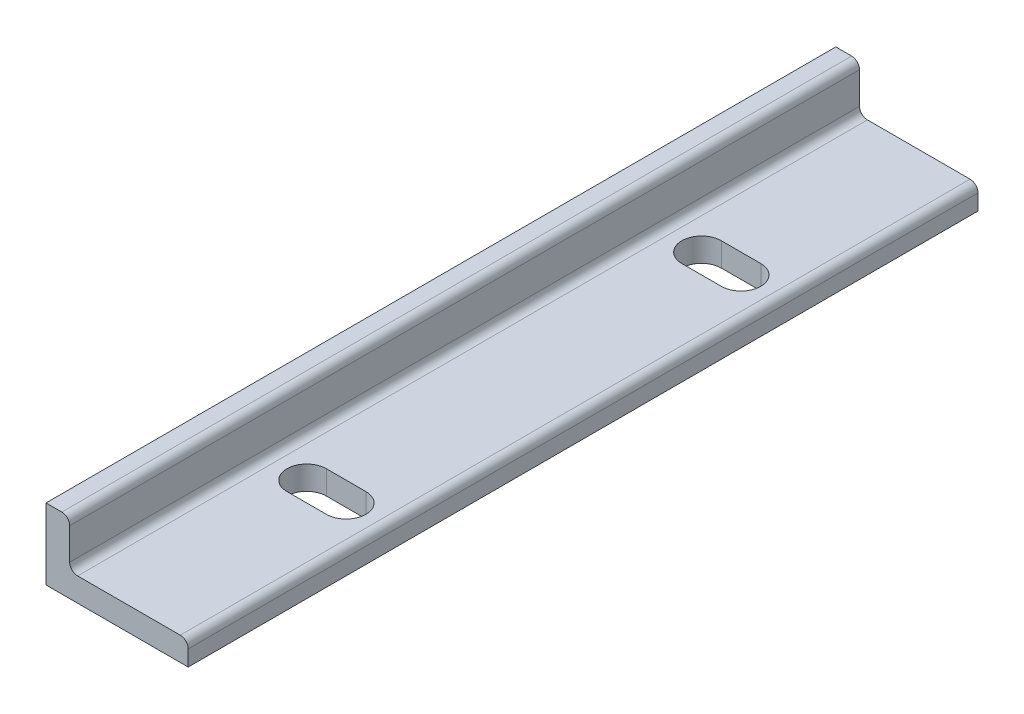
ISO-10303-21;
HEADER;
FILE_DESCRIPTION(('STEP AP214'),'2;1');
FILE_NAME('part.step','',(''),(''),'','','');
FILE_SCHEMA(('AUTOMOTIVE_DESIGN { 1 0 10303 214 1 1 1 1 }'));
ENDSEC;
DATA;
#1=APPLICATION_CONTEXT('core data for automotive mechanical design processes');
#2=APPLICATION_PROTOCOL_DEFINITION('international standard','automotive_design',2000,#1);
#3=PRODUCT_CONTEXT('',#1,'mechanical');
#4=PRODUCT('Part','Part','',(#3));
#5=PRODUCT_RELATED_PRODUCT_CATEGORY('part','',(#4));
#6=PRODUCT_DEFINITION_FORMATION('','',#4);
#7=PRODUCT_DEFINITION_CONTEXT('part definition',#1,'design');
#8=PRODUCT_DEFINITION('design','',#6,#7);
#9=PRODUCT_DEFINITION_SHAPE('','',#8);
#10=(LENGTH_UNIT() NAMED_UNIT(*) SI_UNIT(.MILLI.,.METRE.));
#11=(NAMED_UNIT(*) PLANE_ANGLE_UNIT() SI_UNIT($,.RADIAN.));
#12=(NAMED_UNIT(*) SI_UNIT($,.STERADIAN.) SOLID_ANGLE_UNIT());
#13=UNCERTAINTY_MEASURE_WITH_UNIT(LENGTH_MEASURE(1.E-05),#10,'distance_accuracy_value','');
#14=(GEOMETRIC_REPRESENTATION_CONTEXT(3) GLOBAL_UNCERTAINTY_ASSIGNED_CONTEXT((#13)) GLOBAL_UNIT_ASSIGNED_CONTEXT((#10,
#11,#12)) REPRESENTATION_CONTEXT('',''));
#15=CARTESIAN_POINT('',(0.,0.,0.));
#16=DIRECTION('',(0.,0.,1.));
#17=DIRECTION('',(1.,0.,0.));
#18=AXIS2_PLACEMENT_3D('',#15,#16,#17);
#19=CARTESIAN_POINT('',(0.,9.,100.));
#20=DIRECTION('',(1.,0.,0.));
#21=DIRECTION('',(0.,1.,0.));
#22=AXIS2_PLACEMENT_3D('',#19,#20,#21);
#23=PLANE('',#22);
#24=DIRECTION('',(0.,-1.,0.));
#25=VECTOR('',#24,1.);
#26=CARTESIAN_POINT('',(0.,9.,0.));
#27=LINE('',#26,#25);
#28=CARTESIAN_POINT('',(0.,9.,0.));
#29=VERTEX_POINT('',#28);
#30=CARTESIAN_POINT('',(0.,0.,0.));
#31=VERTEX_POINT('',#30);
#32=EDGE_CURVE('E208',#29,#31,#27,.T.);
#33=ORIENTED_EDGE('',*,*,#32,.T.);
#34=DIRECTION('',(0.,0.,-1.));
#35=VECTOR('',#34,1.);
#36=CARTESIAN_POINT('',(0.,0.,100.));
#37=LINE('',#36,#35);
#38=CARTESIAN_POINT('',(0.,0.,100.));
#39=VERTEX_POINT('',#38);
#40=EDGE_CURVE('E306',#39,#31,#37,.T.);
#41=ORIENTED_EDGE('',*,*,#40,.F.);
#42=DIRECTION('',(0.,-1.,0.));
#43=VECTOR('',#42,1.);
#44=CARTESIAN_POINT('',(0.,9.,100.));
#45=LINE('',#44,#43);
#46=CARTESIAN_POINT('',(0.,9.,100.));
#47=VERTEX_POINT('',#46);
#48=EDGE_CURVE('E255',#47,#39,#45,.T.);
#49=ORIENTED_EDGE('',*,*,#48,.F.);
#50=DIRECTION('',(0.,0.,-1.));
#51=VECTOR('',#50,1.);
#52=CARTESIAN_POINT('',(0.,9.,100.));
#53=LINE('',#52,#51);
#54=EDGE_CURVE('E278',#47,#29,#53,.T.);
#55=ORIENTED_EDGE('',*,*,#54,.T.);
#56=EDGE_LOOP('',(#33,#41,#49,#55));
#57=FACE_BOUND('',#56,.T.);
#58=ADVANCED_FACE('F39',(#57),#23,.F.);
#59=CARTESIAN_POINT('',(0.,0.,100.));
#60=DIRECTION('',(0.,1.,0.));
#61=DIRECTION('',(0.,0.,1.));
#62=AXIS2_PLACEMENT_3D('',#59,#60,#61);
#63=PLANE('',#62);
#64=CARTESIAN_POINT('',(13.,0.,25.));
#65=DIRECTION('',(0.,1.,0.));
#66=DIRECTION('',(1.,0.,0.));
#67=AXIS2_PLACEMENT_3D('',#64,#65,#66);
#68=CIRCLE('',#67,2.49999999999999);
#69=CARTESIAN_POINT('',(13.,0.,27.5));
#70=VERTEX_POINT('',#69);
#71=CARTESIAN_POINT('',(13.,0.,22.5));
#72=VERTEX_POINT('',#71);
#73=EDGE_CURVE('E63',#70,#72,#68,.T.);
#74=ORIENTED_EDGE('',*,*,#73,.T.);
#75=DIRECTION('',(-1.,0.,0.));
#76=VECTOR('',#75,1.);
#77=CARTESIAN_POINT('',(8.,0.,22.5));
#78=LINE('',#77,#76);
#79=CARTESIAN_POINT('',(8.,0.,22.5));
#80=VERTEX_POINT('',#79);
#81=EDGE_CURVE('E225',#72,#80,#78,.T.);
#82=ORIENTED_EDGE('',*,*,#81,.T.);
#83=CARTESIAN_POINT('',(8.,0.,25.));
#84=DIRECTION('',(0.,1.,0.));
#85=DIRECTION('',(1.,0.,0.));
#86=AXIS2_PLACEMENT_3D('',#83,#84,#85);
#87=CIRCLE('',#86,2.49999999999999);
#88=CARTESIAN_POINT('',(8.,0.,27.5));
#89=VERTEX_POINT('',#88);
#90=EDGE_CURVE('E214',#80,#89,#87,.T.);
#91=ORIENTED_EDGE('',*,*,#90,.T.);
#92=DIRECTION('',(1.,0.,0.));
#93=VECTOR('',#92,1.);
#94=CARTESIAN_POINT('',(8.,0.,27.5));
#95=LINE('',#94,#93);
#96=EDGE_CURVE('E218',#89,#70,#95,.T.);
#97=ORIENTED_EDGE('',*,*,#96,.T.);
#98=EDGE_LOOP('',(#74,#82,#91,#97));
#99=FACE_BOUND('',#98,.T.);
#100=CARTESIAN_POINT('',(13.,0.,75.));
#101=DIRECTION('',(0.,1.,0.));
#102=DIRECTION('',(-1.,0.,0.));
#103=AXIS2_PLACEMENT_3D('',#100,#101,#102);
#104=CIRCLE('',#103,2.49999999999999);
#105=CARTESIAN_POINT('',(13.,0.,77.5));
#106=VERTEX_POINT('',#105);
#107=CARTESIAN_POINT('',(13.,0.,72.5));
#108=VERTEX_POINT('',#107);
#109=EDGE_CURVE('E55',#106,#108,#104,.T.);
#110=ORIENTED_EDGE('',*,*,#109,.T.);
#111=DIRECTION('',(-1.,0.,0.));
#112=VECTOR('',#111,1.);
#113=CARTESIAN_POINT('',(8.,0.,72.5));
#114=LINE('',#113,#112);
#115=CARTESIAN_POINT('',(8.,0.,72.5));
#116=VERTEX_POINT('',#115);
#117=EDGE_CURVE('E181',#108,#116,#114,.T.);
#118=ORIENTED_EDGE('',*,*,#117,.T.);
#119=CARTESIAN_POINT('',(8.,0.,75.));
#120=DIRECTION('',(0.,1.,0.));
#121=DIRECTION('',(-1.,0.,0.));
#122=AXIS2_PLACEMENT_3D('',#119,#120,#121);
#123=CIRCLE('',#122,2.49999999999999);
#124=CARTESIAN_POINT('',(8.,0.,77.5));
#125=VERTEX_POINT('',#124);
#126=EDGE_CURVE('E170',#116,#125,#123,.T.);
#127=ORIENTED_EDGE('',*,*,#126,.T.);
#128=DIRECTION('',(1.,0.,0.));
#129=VECTOR('',#128,1.);
#130=CARTESIAN_POINT('',(8.,0.,77.5));
#131=LINE('',#130,#129);
#132=EDGE_CURVE('E162',#125,#106,#131,.T.);
#133=ORIENTED_EDGE('',*,*,#132,.T.);
#134=EDGE_LOOP('',(#110,#118,#127,#133));
#135=FACE_BOUND('',#134,.T.);
#136=DIRECTION('',(1.,0.,0.));
#137=VECTOR('',#136,1.);
#138=CARTESIAN_POINT('',(0.,0.,0.));
#139=LINE('',#138,#137);
#140=CARTESIAN_POINT('',(18.,0.,0.));
#141=VERTEX_POINT('',#140);
#142=EDGE_CURVE('E282',#31,#141,#139,.T.);
#143=ORIENTED_EDGE('',*,*,#142,.T.);
#144=DIRECTION('',(0.,0.,-1.));
#145=VECTOR('',#144,1.);
#146=CARTESIAN_POINT('',(18.,0.,100.));
#147=LINE('',#146,#145);
#148=CARTESIAN_POINT('',(18.,0.,100.));
#149=VERTEX_POINT('',#148);
#150=EDGE_CURVE('E302',#149,#141,#147,.T.);
#151=ORIENTED_EDGE('',*,*,#150,.F.);
#152=DIRECTION('',(1.,0.,0.));
#153=VECTOR('',#152,1.);
#154=CARTESIAN_POINT('',(0.,0.,100.));
#155=LINE('',#154,#153);
#156=EDGE_CURVE('E259',#39,#149,#155,.T.);
#157=ORIENTED_EDGE('',*,*,#156,.F.);
#158=ORIENTED_EDGE('',*,*,#40,.T.);
#159=EDGE_LOOP('',(#143,#151,#157,#158));
#160=FACE_BOUND('',#159,.T.);
#161=ADVANCED_FACE('F183',(#99,#135,#160),#63,.F.);
#162=CARTESIAN_POINT('',(18.,0.,100.));
#163=DIRECTION('',(-1.,0.,0.));
#164=DIRECTION('',(0.,0.,1.));
#165=AXIS2_PLACEMENT_3D('',#162,#163,#164);
#166=PLANE('',#165);
#167=DIRECTION('',(0.,1.,0.));
#168=VECTOR('',#167,1.);
#169=CARTESIAN_POINT('',(18.,0.,0.));
#170=LINE('',#169,#168);
#171=CARTESIAN_POINT('',(18.,2.,0.));
#172=VERTEX_POINT('',#171);
#173=EDGE_CURVE('E285',#141,#172,#170,.T.);
#174=ORIENTED_EDGE('',*,*,#173,.T.);
#175=DIRECTION('',(0.,0.,-1.));
#176=VECTOR('',#175,1.);
#177=CARTESIAN_POINT('',(18.,2.,100.));
#178=LINE('',#177,#176);
#179=CARTESIAN_POINT('',(18.,2.,100.));
#180=VERTEX_POINT('',#179);
#181=EDGE_CURVE('E330',#172,#180,#178,.F.);
#182=ORIENTED_EDGE('',*,*,#181,.T.);
#183=DIRECTION('',(0.,1.,0.));
#184=VECTOR('',#183,1.);
#185=CARTESIAN_POINT('',(18.,0.,100.));
#186=LINE('',#185,#184);
#187=EDGE_CURVE('E263',#149,#180,#186,.T.);
#188=ORIENTED_EDGE('',*,*,#187,.F.);
#189=ORIENTED_EDGE('',*,*,#150,.T.);
#190=EDGE_LOOP('',(#174,#182,#188,#189));
#191=FACE_BOUND('',#190,.T.);
#192=ADVANCED_FACE('F379',(#191),#166,.F.);
#193=CARTESIAN_POINT('',(18.,3.,100.));
#194=DIRECTION('',(0.,-1.,0.));
#195=DIRECTION('',(1.,0.,0.));
#196=AXIS2_PLACEMENT_3D('',#193,#194,#195);
#197=PLANE('',#196);
#198=DIRECTION('',(1.,0.,0.));
#199=VECTOR('',#198,1.);
#200=CARTESIAN_POINT('',(8.,3.,27.5));
#201=LINE('',#200,#199);
#202=CARTESIAN_POINT('',(8.,3.,27.5));
#203=VERTEX_POINT('',#202);
#204=CARTESIAN_POINT('',(13.,3.,27.5));
#205=VERTEX_POINT('',#204);
#206=EDGE_CURVE('E233',#203,#205,#201,.T.);
#207=ORIENTED_EDGE('',*,*,#206,.F.);
#208=CARTESIAN_POINT('',(8.,3.,25.));
#209=DIRECTION('',(0.,1.,0.));
#210=DIRECTION('',(1.,0.,0.));
#211=AXIS2_PLACEMENT_3D('',#208,#209,#210);
#212=CIRCLE('',#211,2.49999999999999);
#213=CARTESIAN_POINT('',(8.,3.,22.5));
#214=VERTEX_POINT('',#213);
#215=EDGE_CURVE('E230',#214,#203,#212,.T.);
#216=ORIENTED_EDGE('',*,*,#215,.F.);
#217=DIRECTION('',(-1.,0.,0.));
#218=VECTOR('',#217,1.);
#219=CARTESIAN_POINT('',(8.,3.,22.5));
#220=LINE('',#219,#218);
#221=CARTESIAN_POINT('',(13.,3.,22.5));
#222=VERTEX_POINT('',#221);
#223=EDGE_CURVE('E219',#222,#214,#220,.T.);
#224=ORIENTED_EDGE('',*,*,#223,.F.);
#225=CARTESIAN_POINT('',(13.,3.,25.));
#226=DIRECTION('',(0.,1.,0.));
#227=DIRECTION('',(1.,0.,0.));
#228=AXIS2_PLACEMENT_3D('',#225,#226,#227);
#229=CIRCLE('',#228,2.49999999999999);
#230=EDGE_CURVE('E236',#205,#222,#229,.T.);
#231=ORIENTED_EDGE('',*,*,#230,.F.);
#232=EDGE_LOOP('',(#207,#216,#224,#231));
#233=FACE_BOUND('',#232,.T.);
#234=DIRECTION('',(1.,0.,0.));
#235=VECTOR('',#234,1.);
#236=CARTESIAN_POINT('',(8.,3.,77.5));
#237=LINE('',#236,#235);
#238=CARTESIAN_POINT('',(8.,3.,77.5));
#239=VERTEX_POINT('',#238);
#240=CARTESIAN_POINT('',(13.,3.,77.5));
#241=VERTEX_POINT('',#240);
#242=EDGE_CURVE('E198',#239,#241,#237,.T.);
#243=ORIENTED_EDGE('',*,*,#242,.F.);
#244=CARTESIAN_POINT('',(8.,3.,75.));
#245=DIRECTION('',(0.,1.,0.));
#246=DIRECTION('',(-1.,0.,0.));
#247=AXIS2_PLACEMENT_3D('',#244,#245,#246);
#248=CIRCLE('',#247,2.49999999999999);
#249=CARTESIAN_POINT('',(8.,3.,72.5));
#250=VERTEX_POINT('',#249);
#251=EDGE_CURVE('E179',#250,#239,#248,.T.);
#252=ORIENTED_EDGE('',*,*,#251,.F.);
#253=DIRECTION('',(-1.,0.,0.));
#254=VECTOR('',#253,1.);
#255=CARTESIAN_POINT('',(8.,3.,72.5));
#256=LINE('',#255,#254);
#257=CARTESIAN_POINT('',(13.,3.,72.5));
#258=VERTEX_POINT('',#257);
#259=EDGE_CURVE('E186',#258,#250,#256,.T.);
#260=ORIENTED_EDGE('',*,*,#259,.F.);
#261=CARTESIAN_POINT('',(13.,3.,75.));
#262=DIRECTION('',(0.,1.,0.));
#263=DIRECTION('',(-1.,0.,0.));
#264=AXIS2_PLACEMENT_3D('',#261,#262,#263);
#265=CIRCLE('',#264,2.49999999999999);
#266=EDGE_CURVE('E189',#241,#258,#265,.T.);
#267=ORIENTED_EDGE('',*,*,#266,.F.);
#268=EDGE_LOOP('',(#243,#252,#260,#267));
#269=FACE_BOUND('',#268,.T.);
#270=DIRECTION('',(-1.,0.,0.));
#271=VECTOR('',#270,1.);
#272=CARTESIAN_POINT('',(18.,3.,0.));
#273=LINE('',#272,#271);
#274=CARTESIAN_POINT('',(17.,3.,0.));
#275=VERTEX_POINT('',#274);
#276=CARTESIAN_POINT('',(4.,3.,0.));
#277=VERTEX_POINT('',#276);
#278=EDGE_CURVE('E289',#275,#277,#273,.T.);
#279=ORIENTED_EDGE('',*,*,#278,.T.);
#280=DIRECTION('',(0.,0.,-1.));
#281=VECTOR('',#280,1.);
#282=CARTESIAN_POINT('',(4.,3.,100.));
#283=LINE('',#282,#281);
#284=CARTESIAN_POINT('',(4.,3.,100.));
#285=VERTEX_POINT('',#284);
#286=EDGE_CURVE('E321',#277,#285,#283,.F.);
#287=ORIENTED_EDGE('',*,*,#286,.T.);
#288=DIRECTION('',(-1.,0.,0.));
#289=VECTOR('',#288,1.);
#290=CARTESIAN_POINT('',(18.,3.,100.));
#291=LINE('',#290,#289);
#292=CARTESIAN_POINT('',(17.,3.,100.));
#293=VERTEX_POINT('',#292);
#294=EDGE_CURVE('E267',#293,#285,#291,.T.);
#295=ORIENTED_EDGE('',*,*,#294,.F.);
#296=DIRECTION('',(0.,0.,-1.));
#297=VECTOR('',#296,1.);
#298=CARTESIAN_POINT('',(17.,3.,100.));
#299=LINE('',#298,#297);
#300=EDGE_CURVE('E317',#293,#275,#299,.T.);
#301=ORIENTED_EDGE('',*,*,#300,.T.);
#302=EDGE_LOOP('',(#279,#287,#295,#301));
#303=FACE_BOUND('',#302,.T.);
#304=ADVANCED_FACE('F351',(#233,#269,#303),#197,.F.);
#305=CARTESIAN_POINT('',(3.,3.,100.));
#306=DIRECTION('',(-1.,0.,0.));
#307=DIRECTION('',(0.,-1.,0.));
#308=AXIS2_PLACEMENT_3D('',#305,#306,#307);
#309=PLANE('',#308);
#310=DIRECTION('',(0.,1.,0.));
#311=VECTOR('',#310,1.);
#312=CARTESIAN_POINT('',(3.,3.,100.));
#313=LINE('',#312,#311);
#314=CARTESIAN_POINT('',(3.,4.,100.));
#315=VERTEX_POINT('',#314);
#316=CARTESIAN_POINT('',(3.,8.,100.));
#317=VERTEX_POINT('',#316);
#318=EDGE_CURVE('E271',#315,#317,#313,.T.);
#319=ORIENTED_EDGE('',*,*,#318,.F.);
#320=DIRECTION('',(0.,0.,-1.));
#321=VECTOR('',#320,1.);
#322=CARTESIAN_POINT('',(3.,4.,0.));
#323=LINE('',#322,#321);
#324=CARTESIAN_POINT('',(3.,4.,0.));
#325=VERTEX_POINT('',#324);
#326=EDGE_CURVE('E313',#315,#325,#323,.T.);
#327=ORIENTED_EDGE('',*,*,#326,.T.);
#328=DIRECTION('',(0.,1.,0.));
#329=VECTOR('',#328,1.);
#330=CARTESIAN_POINT('',(3.,3.,0.));
#331=LINE('',#330,#329);
#332=CARTESIAN_POINT('',(3.,8.,0.));
#333=VERTEX_POINT('',#332);
#334=EDGE_CURVE('E293',#325,#333,#331,.T.);
#335=ORIENTED_EDGE('',*,*,#334,.T.);
#336=DIRECTION('',(0.,0.,-1.));
#337=VECTOR('',#336,1.);
#338=CARTESIAN_POINT('',(3.,8.,100.));
#339=LINE('',#338,#337);
#340=EDGE_CURVE('E310',#333,#317,#339,.F.);
#341=ORIENTED_EDGE('',*,*,#340,.T.);
#342=EDGE_LOOP('',(#319,#327,#335,#341));
#343=FACE_BOUND('',#342,.T.);
#344=ADVANCED_FACE('F361',(#343),#309,.F.);
#345=CARTESIAN_POINT('',(3.,9.,100.));
#346=DIRECTION('',(0.,-1.,0.));
#347=DIRECTION('',(0.,0.,-1.));
#348=AXIS2_PLACEMENT_3D('',#345,#346,#347);
#349=PLANE('',#348);
#350=DIRECTION('',(-1.,0.,0.));
#351=VECTOR('',#350,1.);
#352=CARTESIAN_POINT('',(3.,9.,100.));
#353=LINE('',#352,#351);
#354=CARTESIAN_POINT('',(2.,9.,100.));
#355=VERTEX_POINT('',#354);
#356=EDGE_CURVE('E275',#355,#47,#353,.T.);
#357=ORIENTED_EDGE('',*,*,#356,.F.);
#358=DIRECTION('',(0.,0.,-1.));
#359=VECTOR('',#358,1.);
#360=CARTESIAN_POINT('',(2.,9.,100.));
#361=LINE('',#360,#359);
#362=CARTESIAN_POINT('',(2.,9.,0.));
#363=VERTEX_POINT('',#362);
#364=EDGE_CURVE('E339',#355,#363,#361,.T.);
#365=ORIENTED_EDGE('',*,*,#364,.T.);
#366=DIRECTION('',(-1.,0.,0.));
#367=VECTOR('',#366,1.);
#368=CARTESIAN_POINT('',(3.,9.,0.));
#369=LINE('',#368,#367);
#370=EDGE_CURVE('E260',#363,#29,#369,.T.);
#371=ORIENTED_EDGE('',*,*,#370,.T.);
#372=ORIENTED_EDGE('',*,*,#54,.F.);
#373=EDGE_LOOP('',(#357,#365,#371,#372));
#374=FACE_BOUND('',#373,.T.);
#375=ADVANCED_FACE('F368',(#374),#349,.F.);
#376=CARTESIAN_POINT('',(0.,0.,100.));
#377=DIRECTION('',(0.,0.,1.));
#378=DIRECTION('',(1.,0.,0.));
#379=AXIS2_PLACEMENT_3D('',#376,#377,#378);
#380=PLANE('',#379);
#381=ORIENTED_EDGE('',*,*,#187,.T.);
#382=CARTESIAN_POINT('',(17.,2.,100.));
#383=DIRECTION('',(0.,0.,1.));
#384=DIRECTION('',(1.,0.,0.));
#385=AXIS2_PLACEMENT_3D('',#382,#383,#384);
#386=CIRCLE('',#385,1.);
#387=EDGE_CURVE('E336',#180,#293,#386,.T.);
#388=ORIENTED_EDGE('',*,*,#387,.T.);
#389=ORIENTED_EDGE('',*,*,#294,.T.);
#390=CARTESIAN_POINT('',(4.,4.,100.));
#391=DIRECTION('',(0.,0.,1.));
#392=DIRECTION('',(1.,0.,0.));
#393=AXIS2_PLACEMENT_3D('',#390,#391,#392);
#394=CIRCLE('',#393,1.);
#395=EDGE_CURVE('E11',#285,#315,#394,.F.);
#396=ORIENTED_EDGE('',*,*,#395,.T.);
#397=ORIENTED_EDGE('',*,*,#318,.T.);
#398=CARTESIAN_POINT('',(2.,8.,100.));
#399=DIRECTION('',(0.,0.,1.));
#400=DIRECTION('',(1.,0.,0.));
#401=AXIS2_PLACEMENT_3D('',#398,#399,#400);
#402=CIRCLE('',#401,1.);
#403=EDGE_CURVE('E333',#317,#355,#402,.T.);
#404=ORIENTED_EDGE('',*,*,#403,.T.);
#405=ORIENTED_EDGE('',*,*,#356,.T.);
#406=ORIENTED_EDGE('',*,*,#48,.T.);
#407=ORIENTED_EDGE('',*,*,#156,.T.);
#408=EDGE_LOOP('',(#381,#388,#389,#396,#397,#404,#405,#406,#407));
#409=FACE_BOUND('',#408,.T.);
#410=ADVANCED_FACE('F358',(#409),#380,.T.);
#411=CARTESIAN_POINT('',(0.,0.,0.));
#412=DIRECTION('',(0.,0.,1.));
#413=DIRECTION('',(1.,0.,0.));
#414=AXIS2_PLACEMENT_3D('',#411,#412,#413);
#415=PLANE('',#414);
#416=ORIENTED_EDGE('',*,*,#278,.F.);
#417=CARTESIAN_POINT('',(17.,2.,0.));
#418=DIRECTION('',(0.,0.,1.));
#419=DIRECTION('',(1.,0.,0.));
#420=AXIS2_PLACEMENT_3D('',#417,#418,#419);
#421=CIRCLE('',#420,1.);
#422=EDGE_CURVE('E327',#275,#172,#421,.F.);
#423=ORIENTED_EDGE('',*,*,#422,.T.);
#424=ORIENTED_EDGE('',*,*,#173,.F.);
#425=ORIENTED_EDGE('',*,*,#142,.F.);
#426=ORIENTED_EDGE('',*,*,#32,.F.);
#427=ORIENTED_EDGE('',*,*,#370,.F.);
#428=CARTESIAN_POINT('',(2.,8.,0.));
#429=DIRECTION('',(0.,0.,1.));
#430=DIRECTION('',(1.,0.,0.));
#431=AXIS2_PLACEMENT_3D('',#428,#429,#430);
#432=CIRCLE('',#431,1.);
#433=EDGE_CURVE('E324',#363,#333,#432,.F.);
#434=ORIENTED_EDGE('',*,*,#433,.T.);
#435=ORIENTED_EDGE('',*,*,#334,.F.);
#436=CARTESIAN_POINT('',(4.,4.,0.));
#437=DIRECTION('',(0.,0.,1.));
#438=DIRECTION('',(1.,0.,0.));
#439=AXIS2_PLACEMENT_3D('',#436,#437,#438);
#440=CIRCLE('',#439,1.);
#441=EDGE_CURVE('E48',#325,#277,#440,.T.);
#442=ORIENTED_EDGE('',*,*,#441,.T.);
#443=EDGE_LOOP('',(#416,#423,#424,#425,#426,#427,#434,#435,#442));
#444=FACE_BOUND('',#443,.T.);
#445=ADVANCED_FACE('F346',(#444),#415,.F.);
#446=CARTESIAN_POINT('',(4.,4.,100.));
#447=DIRECTION('',(0.,0.,1.));
#448=DIRECTION('',(1.,0.,0.));
#449=AXIS2_PLACEMENT_3D('',#446,#447,#448);
#450=CYLINDRICAL_SURFACE('',#449,1.);
#451=ORIENTED_EDGE('',*,*,#395,.F.);
#452=ORIENTED_EDGE('',*,*,#286,.F.);
#453=ORIENTED_EDGE('',*,*,#441,.F.);
#454=ORIENTED_EDGE('',*,*,#326,.F.);
#455=EDGE_LOOP('',(#451,#452,#453,#454));
#456=FACE_BOUND('',#455,.T.);
#457=ADVANCED_FACE('F355',(#456),#450,.F.);
#458=CARTESIAN_POINT('',(17.,2.,100.));
#459=DIRECTION('',(0.,0.,-1.));
#460=DIRECTION('',(-1.,0.,0.));
#461=AXIS2_PLACEMENT_3D('',#458,#459,#460);
#462=CYLINDRICAL_SURFACE('',#461,1.);
#463=ORIENTED_EDGE('',*,*,#387,.F.);
#464=ORIENTED_EDGE('',*,*,#181,.F.);
#465=ORIENTED_EDGE('',*,*,#422,.F.);
#466=ORIENTED_EDGE('',*,*,#300,.F.);
#467=EDGE_LOOP('',(#463,#464,#465,#466));
#468=FACE_BOUND('',#467,.T.);
#469=ADVANCED_FACE('F382',(#468),#462,.T.);
#470=CARTESIAN_POINT('',(2.,8.,100.));
#471=DIRECTION('',(0.,0.,-1.));
#472=DIRECTION('',(-1.,0.,0.));
#473=AXIS2_PLACEMENT_3D('',#470,#471,#472);
#474=CYLINDRICAL_SURFACE('',#473,1.);
#475=ORIENTED_EDGE('',*,*,#403,.F.);
#476=ORIENTED_EDGE('',*,*,#340,.F.);
#477=ORIENTED_EDGE('',*,*,#433,.F.);
#478=ORIENTED_EDGE('',*,*,#364,.F.);
#479=EDGE_LOOP('',(#475,#476,#477,#478));
#480=FACE_BOUND('',#479,.T.);
#481=ADVANCED_FACE('F41',(#480),#474,.T.);
#482=CARTESIAN_POINT('',(8.,0.,22.5));
#483=DIRECTION('',(0.,0.,-1.));
#484=DIRECTION('',(-1.,0.,0.));
#485=AXIS2_PLACEMENT_3D('',#482,#483,#484);
#486=PLANE('',#485);
#487=ORIENTED_EDGE('',*,*,#223,.T.);
#488=DIRECTION('',(0.,1.,0.));
#489=VECTOR('',#488,1.);
#490=CARTESIAN_POINT('',(8.,0.,22.5));
#491=LINE('',#490,#489);
#492=EDGE_CURVE('E199',#80,#214,#491,.T.);
#493=ORIENTED_EDGE('',*,*,#492,.F.);
#494=ORIENTED_EDGE('',*,*,#81,.F.);
#495=DIRECTION('',(0.,1.,0.));
#496=VECTOR('',#495,1.);
#497=CARTESIAN_POINT('',(13.,0.,22.5));
#498=LINE('',#497,#496);
#499=EDGE_CURVE('E245',#72,#222,#498,.T.);
#500=ORIENTED_EDGE('',*,*,#499,.T.);
#501=EDGE_LOOP('',(#487,#493,#494,#500));
#502=FACE_BOUND('',#501,.T.);
#503=ADVANCED_FACE('F388',(#502),#486,.F.);
#504=CARTESIAN_POINT('',(8.,0.,27.5));
#505=DIRECTION('',(0.,0.,1.));
#506=DIRECTION('',(1.,0.,0.));
#507=AXIS2_PLACEMENT_3D('',#504,#505,#506);
#508=PLANE('',#507);
#509=ORIENTED_EDGE('',*,*,#206,.T.);
#510=DIRECTION('',(0.,1.,0.));
#511=VECTOR('',#510,1.);
#512=CARTESIAN_POINT('',(13.,0.,27.5));
#513=LINE('',#512,#511);
#514=EDGE_CURVE('E249',#70,#205,#513,.T.);
#515=ORIENTED_EDGE('',*,*,#514,.F.);
#516=ORIENTED_EDGE('',*,*,#96,.F.);
#517=DIRECTION('',(0.,1.,0.));
#518=VECTOR('',#517,1.);
#519=CARTESIAN_POINT('',(8.,0.,27.5));
#520=LINE('',#519,#518);
#521=EDGE_CURVE('E229',#89,#203,#520,.T.);
#522=ORIENTED_EDGE('',*,*,#521,.T.);
#523=EDGE_LOOP('',(#509,#515,#516,#522));
#524=FACE_BOUND('',#523,.T.);
#525=ADVANCED_FACE('F415',(#524),#508,.F.);
#526=CARTESIAN_POINT('',(8.,0.,25.));
#527=DIRECTION('',(0.,1.,0.));
#528=DIRECTION('',(-1.,0.,0.));
#529=AXIS2_PLACEMENT_3D('',#526,#527,#528);
#530=CYLINDRICAL_SURFACE('',#529,2.49999999999999);
#531=ORIENTED_EDGE('',*,*,#215,.T.);
#532=ORIENTED_EDGE('',*,*,#521,.F.);
#533=ORIENTED_EDGE('',*,*,#90,.F.);
#534=ORIENTED_EDGE('',*,*,#492,.T.);
#535=EDGE_LOOP('',(#531,#532,#533,#534));
#536=FACE_BOUND('',#535,.T.);
#537=ADVANCED_FACE('F411',(#536),#530,.F.);
#538=CARTESIAN_POINT('',(13.,0.,25.));
#539=DIRECTION('',(0.,1.,0.));
#540=DIRECTION('',(-1.,0.,0.));
#541=AXIS2_PLACEMENT_3D('',#538,#539,#540);
#542=CYLINDRICAL_SURFACE('',#541,2.49999999999999);
#543=ORIENTED_EDGE('',*,*,#230,.T.);
#544=ORIENTED_EDGE('',*,*,#499,.F.);
#545=ORIENTED_EDGE('',*,*,#73,.F.);
#546=ORIENTED_EDGE('',*,*,#514,.T.);
#547=EDGE_LOOP('',(#543,#544,#545,#546));
#548=FACE_BOUND('',#547,.T.);
#549=ADVANCED_FACE('F414',(#548),#542,.F.);
#550=CARTESIAN_POINT('',(8.,0.,72.5));
#551=DIRECTION('',(0.,0.,-1.));
#552=DIRECTION('',(-1.,0.,0.));
#553=AXIS2_PLACEMENT_3D('',#550,#551,#552);
#554=PLANE('',#553);
#555=ORIENTED_EDGE('',*,*,#259,.T.);
#556=DIRECTION('',(0.,1.,0.));
#557=VECTOR('',#556,1.);
#558=CARTESIAN_POINT('',(8.,0.,72.5));
#559=LINE('',#558,#557);
#560=EDGE_CURVE('E205',#116,#250,#559,.T.);
#561=ORIENTED_EDGE('',*,*,#560,.F.);
#562=ORIENTED_EDGE('',*,*,#117,.F.);
#563=DIRECTION('',(0.,1.,0.));
#564=VECTOR('',#563,1.);
#565=CARTESIAN_POINT('',(13.,0.,72.5));
#566=LINE('',#565,#564);
#567=EDGE_CURVE('E209',#108,#258,#566,.T.);
#568=ORIENTED_EDGE('',*,*,#567,.T.);
#569=EDGE_LOOP('',(#555,#561,#562,#568));
#570=FACE_BOUND('',#569,.T.);
#571=ADVANCED_FACE('F422',(#570),#554,.F.);
#572=CARTESIAN_POINT('',(8.,0.,77.5));
#573=DIRECTION('',(0.,0.,1.));
#574=DIRECTION('',(1.,0.,0.));
#575=AXIS2_PLACEMENT_3D('',#572,#573,#574);
#576=PLANE('',#575);
#577=ORIENTED_EDGE('',*,*,#242,.T.);
#578=DIRECTION('',(0.,1.,0.));
#579=VECTOR('',#578,1.);
#580=CARTESIAN_POINT('',(13.,0.,77.5));
#581=LINE('',#580,#579);
#582=EDGE_CURVE('E166',#106,#241,#581,.T.);
#583=ORIENTED_EDGE('',*,*,#582,.F.);
#584=ORIENTED_EDGE('',*,*,#132,.F.);
#585=DIRECTION('',(0.,1.,0.));
#586=VECTOR('',#585,1.);
#587=CARTESIAN_POINT('',(8.,0.,77.5));
#588=LINE('',#587,#586);
#589=EDGE_CURVE('E165',#125,#239,#588,.T.);
#590=ORIENTED_EDGE('',*,*,#589,.T.);
#591=EDGE_LOOP('',(#577,#583,#584,#590));
#592=FACE_BOUND('',#591,.T.);
#593=ADVANCED_FACE('F164',(#592),#576,.F.);
#594=CARTESIAN_POINT('',(8.,0.,75.));
#595=DIRECTION('',(0.,1.,0.));
#596=DIRECTION('',(-1.,0.,0.));
#597=AXIS2_PLACEMENT_3D('',#594,#595,#596);
#598=CYLINDRICAL_SURFACE('',#597,2.49999999999999);
#599=ORIENTED_EDGE('',*,*,#251,.T.);
#600=ORIENTED_EDGE('',*,*,#589,.F.);
#601=ORIENTED_EDGE('',*,*,#126,.F.);
#602=ORIENTED_EDGE('',*,*,#560,.T.);
#603=EDGE_LOOP('',(#599,#600,#601,#602));
#604=FACE_BOUND('',#603,.T.);
#605=ADVANCED_FACE('F175',(#604),#598,.F.);
#606=CARTESIAN_POINT('',(13.,0.,75.));
#607=DIRECTION('',(0.,1.,0.));
#608=DIRECTION('',(-1.,0.,0.));
#609=AXIS2_PLACEMENT_3D('',#606,#607,#608);
#610=CYLINDRICAL_SURFACE('',#609,2.49999999999999);
#611=ORIENTED_EDGE('',*,*,#266,.T.);
#612=ORIENTED_EDGE('',*,*,#567,.F.);
#613=ORIENTED_EDGE('',*,*,#109,.F.);
#614=ORIENTED_EDGE('',*,*,#582,.T.);
#615=EDGE_LOOP('',(#611,#612,#613,#614));
#616=FACE_BOUND('',#615,.T.);
#617=ADVANCED_FACE('F428',(#616),#610,.F.);
#618=CLOSED_SHELL('',(#58,#161,#192,#304,#344,#375,#410,#445,#457,#469,#481,#503,#525,#537,#549,
#571,#593,#605,#617));
#619=MANIFOLD_SOLID_BREP('B2',#618);
#620=ADVANCED_BREP_SHAPE_REPRESENTATION('',(#18,#619),#14);
#621=SHAPE_DEFINITION_REPRESENTATION(#9,#620);
ENDSEC;
END-ISO-10303-21;
